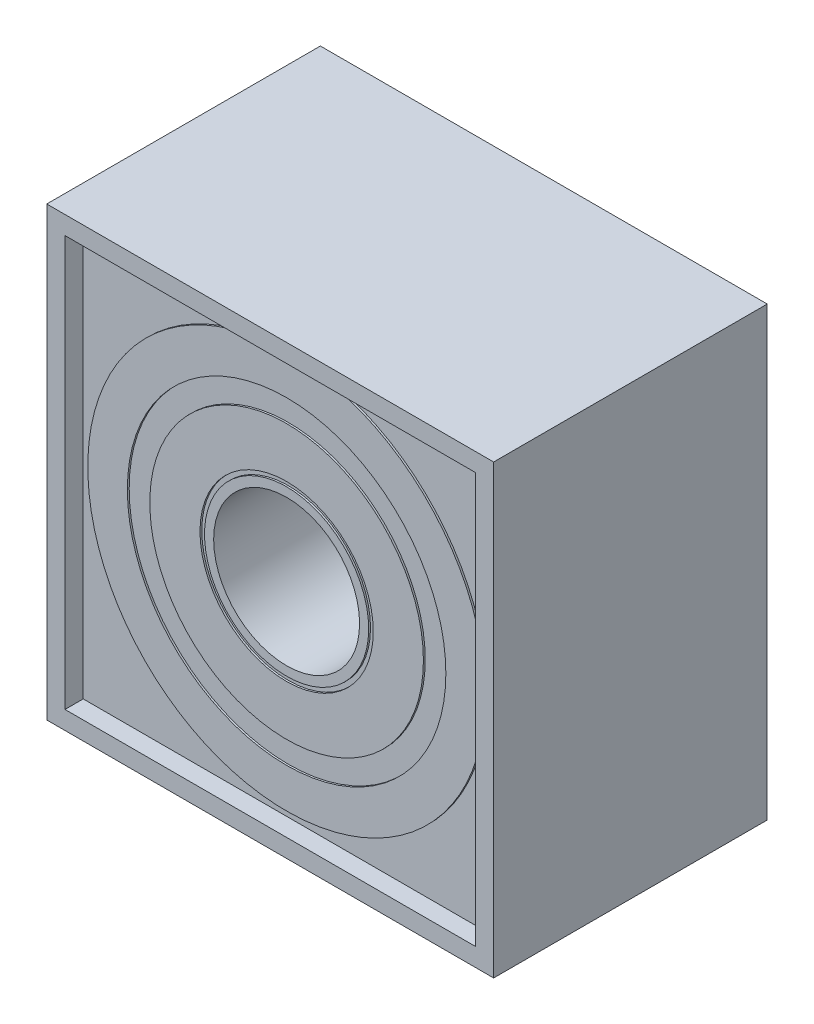
ISO-10303-21;
HEADER;
FILE_DESCRIPTION(('STEP AP214'),'2;1');
FILE_NAME('part.step','',(''),(''),'','','');
FILE_SCHEMA(('AUTOMOTIVE_DESIGN { 1 0 10303 214 1 1 1 1 }'));
ENDSEC;
DATA;
#1=APPLICATION_CONTEXT('core data for automotive mechanical design processes');
#2=APPLICATION_PROTOCOL_DEFINITION('international standard','automotive_design',2000,#1);
#3=PRODUCT_CONTEXT('',#1,'mechanical');
#4=PRODUCT('Part','Part','',(#3));
#5=PRODUCT_RELATED_PRODUCT_CATEGORY('part','',(#4));
#6=PRODUCT_DEFINITION_FORMATION('','',#4);
#7=PRODUCT_DEFINITION_CONTEXT('part definition',#1,'design');
#8=PRODUCT_DEFINITION('design','',#6,#7);
#9=PRODUCT_DEFINITION_SHAPE('','',#8);
#10=(LENGTH_UNIT() NAMED_UNIT(*) SI_UNIT(.MILLI.,.METRE.));
#11=(NAMED_UNIT(*) PLANE_ANGLE_UNIT() SI_UNIT($,.RADIAN.));
#12=(NAMED_UNIT(*) SI_UNIT($,.STERADIAN.) SOLID_ANGLE_UNIT());
#13=UNCERTAINTY_MEASURE_WITH_UNIT(LENGTH_MEASURE(1.E-05),#10,'distance_accuracy_value','');
#14=(GEOMETRIC_REPRESENTATION_CONTEXT(3) GLOBAL_UNCERTAINTY_ASSIGNED_CONTEXT((#13)) GLOBAL_UNIT_ASSIGNED_CONTEXT((#10,
#11,#12)) REPRESENTATION_CONTEXT('',''));
#15=CARTESIAN_POINT('',(0.,0.,0.));
#16=DIRECTION('',(0.,0.,1.));
#17=DIRECTION('',(1.,0.,0.));
#18=AXIS2_PLACEMENT_3D('',#15,#16,#17);
#19=CARTESIAN_POINT('',(0.,0.,14.));
#20=DIRECTION('',(0.,0.,-1.));
#21=DIRECTION('',(-1.,0.,0.));
#22=AXIS2_PLACEMENT_3D('',#19,#20,#21);
#23=PLANE('',#22);
#24=CARTESIAN_POINT('',(0.,0.,14.));
#25=DIRECTION('',(0.,0.,-1.));
#26=DIRECTION('',(-1.,0.,0.));
#27=AXIS2_PLACEMENT_3D('',#24,#25,#26);
#28=CIRCLE('',#27,7.5);
#29=CARTESIAN_POINT('',(7.5,0.,14.));
#30=VERTEX_POINT('',#29);
#31=EDGE_CURVE('E198',#30,#30,#28,.T.);
#32=ORIENTED_EDGE('',*,*,#31,.T.);
#33=EDGE_LOOP('',(#32));
#34=FACE_BOUND('',#33,.T.);
#35=CARTESIAN_POINT('',(0.,0.,14.));
#36=DIRECTION('',(0.,0.,-1.));
#37=DIRECTION('',(-1.,0.,0.));
#38=AXIS2_PLACEMENT_3D('',#35,#36,#37);
#39=CIRCLE('',#38,8.73034277512703);
#40=CARTESIAN_POINT('',(8.73034277512703,0.,14.));
#41=VERTEX_POINT('',#40);
#42=EDGE_CURVE('E12',#41,#41,#39,.T.);
#43=ORIENTED_EDGE('',*,*,#42,.F.);
#44=EDGE_LOOP('',(#43));
#45=FACE_BOUND('',#44,.T.);
#46=ADVANCED_FACE('F74',(#34,#45),#23,.F.);
#47=CARTESIAN_POINT('',(0.,0.,14.));
#48=DIRECTION('',(0.,0.,-1.));
#49=DIRECTION('',(-1.,0.,0.));
#50=AXIS2_PLACEMENT_3D('',#47,#48,#49);
#51=CIRCLE('',#50,4.5);
#52=CARTESIAN_POINT('',(4.5,0.,14.));
#53=VERTEX_POINT('',#52);
#54=EDGE_CURVE('E147',#53,#53,#51,.T.);
#55=ORIENTED_EDGE('',*,*,#54,.T.);
#56=EDGE_LOOP('',(#55));
#57=FACE_BOUND('',#56,.T.);
#58=CARTESIAN_POINT('',(0.,0.,14.));
#59=DIRECTION('',(0.,0.,-1.));
#60=DIRECTION('',(-1.,0.,0.));
#61=AXIS2_PLACEMENT_3D('',#58,#59,#60);
#62=CIRCLE('',#61,4.75);
#63=CARTESIAN_POINT('',(4.75,0.,14.));
#64=VERTEX_POINT('',#63);
#65=EDGE_CURVE('E83',#64,#64,#62,.T.);
#66=ORIENTED_EDGE('',*,*,#65,.F.);
#67=EDGE_LOOP('',(#66));
#68=FACE_BOUND('',#67,.T.);
#69=ADVANCED_FACE('F255',(#57,#68),#23,.F.);
#70=CARTESIAN_POINT('',(0.,0.,7.1));
#71=DIRECTION('',(0.,0.,1.));
#72=DIRECTION('',(1.,0.,0.));
#73=AXIS2_PLACEMENT_3D('',#70,#71,#72);
#74=CYLINDRICAL_SURFACE('',#73,4.);
#75=CARTESIAN_POINT('',(0.,0.,14.1));
#76=DIRECTION('',(0.,0.,1.));
#77=DIRECTION('',(1.,0.,0.));
#78=AXIS2_PLACEMENT_3D('',#75,#76,#77);
#79=CIRCLE('',#78,4.);
#80=CARTESIAN_POINT('',(4.,0.,14.1));
#81=VERTEX_POINT('',#80);
#82=EDGE_CURVE('E201',#81,#81,#79,.T.);
#83=CARTESIAN_POINT('',(0.,0.,0.));
#84=DIRECTION('',(0.,0.,-1.));
#85=DIRECTION('',(-1.,0.,0.));
#86=AXIS2_PLACEMENT_3D('',#83,#84,#85);
#87=CIRCLE('',#86,4.);
#88=CARTESIAN_POINT('',(4.,0.,0.));
#89=VERTEX_POINT('',#88);
#90=EDGE_CURVE('E78',#89,#89,#87,.T.);
#91=CARTESIAN_POINT('',(4.,0.,14.1));
#92=CARTESIAN_POINT('',(4.,0.,13.953125));
#93=CARTESIAN_POINT('',(4.,0.,13.80625));
#94=CARTESIAN_POINT('',(4.,0.,13.5125));
#95=CARTESIAN_POINT('',(4.,0.,13.365625));
#96=CARTESIAN_POINT('',(4.,0.,13.071875));
#97=CARTESIAN_POINT('',(4.,0.,12.925));
#98=CARTESIAN_POINT('',(4.,0.,12.63125));
#99=CARTESIAN_POINT('',(4.,0.,12.484375));
#100=CARTESIAN_POINT('',(4.,0.,12.190625));
#101=CARTESIAN_POINT('',(4.,0.,12.04375));
#102=CARTESIAN_POINT('',(4.,0.,11.75));
#103=CARTESIAN_POINT('',(4.,0.,11.603125));
#104=CARTESIAN_POINT('',(4.,0.,11.309375));
#105=CARTESIAN_POINT('',(4.,0.,11.1625));
#106=CARTESIAN_POINT('',(4.,0.,10.86875));
#107=CARTESIAN_POINT('',(4.,0.,10.721875));
#108=CARTESIAN_POINT('',(4.,0.,10.428125));
#109=CARTESIAN_POINT('',(4.,0.,10.28125));
#110=CARTESIAN_POINT('',(4.,0.,9.9875));
#111=CARTESIAN_POINT('',(4.,0.,9.840625));
#112=CARTESIAN_POINT('',(4.,0.,9.546875));
#113=CARTESIAN_POINT('',(4.,0.,9.4));
#114=CARTESIAN_POINT('',(4.,0.,9.10625));
#115=CARTESIAN_POINT('',(4.,0.,8.959375));
#116=CARTESIAN_POINT('',(4.,0.,8.665625));
#117=CARTESIAN_POINT('',(4.,0.,8.51875));
#118=CARTESIAN_POINT('',(4.,0.,8.225));
#119=CARTESIAN_POINT('',(4.,0.,8.078125));
#120=CARTESIAN_POINT('',(4.,0.,7.784375));
#121=CARTESIAN_POINT('',(4.,0.,7.6375));
#122=CARTESIAN_POINT('',(4.,0.,7.34375));
#123=CARTESIAN_POINT('',(4.,0.,7.196875));
#124=CARTESIAN_POINT('',(4.,0.,6.903125));
#125=CARTESIAN_POINT('',(4.,0.,6.75625));
#126=CARTESIAN_POINT('',(4.,0.,6.4625));
#127=CARTESIAN_POINT('',(4.,0.,6.315625));
#128=CARTESIAN_POINT('',(4.,0.,6.021875));
#129=CARTESIAN_POINT('',(4.,0.,5.875));
#130=CARTESIAN_POINT('',(4.,0.,5.58125));
#131=CARTESIAN_POINT('',(4.,0.,5.434375));
#132=CARTESIAN_POINT('',(4.,0.,5.140625));
#133=CARTESIAN_POINT('',(4.,0.,4.99375));
#134=CARTESIAN_POINT('',(4.,0.,4.7));
#135=CARTESIAN_POINT('',(4.,0.,4.553125));
#136=CARTESIAN_POINT('',(4.,0.,4.259375));
#137=CARTESIAN_POINT('',(4.,0.,4.1125));
#138=CARTESIAN_POINT('',(4.,0.,3.81875));
#139=CARTESIAN_POINT('',(4.,0.,3.671875));
#140=CARTESIAN_POINT('',(4.,0.,3.378125));
#141=CARTESIAN_POINT('',(4.,0.,3.23125));
#142=CARTESIAN_POINT('',(4.,0.,2.9375));
#143=CARTESIAN_POINT('',(4.,0.,2.790625));
#144=CARTESIAN_POINT('',(4.,0.,2.496875));
#145=CARTESIAN_POINT('',(4.,0.,2.35));
#146=CARTESIAN_POINT('',(4.,0.,2.05625));
#147=CARTESIAN_POINT('',(4.,0.,1.909375));
#148=CARTESIAN_POINT('',(4.,0.,1.615625));
#149=CARTESIAN_POINT('',(4.,0.,1.46875));
#150=CARTESIAN_POINT('',(4.,0.,1.175));
#151=CARTESIAN_POINT('',(4.,0.,1.028125));
#152=CARTESIAN_POINT('',(4.,0.,0.734375));
#153=CARTESIAN_POINT('',(4.,0.,0.5875));
#154=CARTESIAN_POINT('',(4.,0.,0.29375));
#155=CARTESIAN_POINT('',(4.,0.,0.146875));
#156=CARTESIAN_POINT('',(4.,0.,0.));
#157=B_SPLINE_CURVE_WITH_KNOTS('',3,(#91,#92,#93,#94,#95,#96,#97,#98,#99,#100,#101,#102,#103,
#104,#105,#106,#107,#108,#109,#110,#111,#112,#113,#114,#115,#116,#117,#118,#119,#120,#121,#122,
#123,#124,#125,#126,#127,#128,#129,#130,#131,#132,#133,#134,#135,#136,#137,#138,#139,#140,#141,
#142,#143,#144,#145,#146,#147,#148,#149,#150,#151,#152,#153,#154,#155,#156),.UNSPECIFIED.,.F.,
.F.,(4,2,2,2,2,2,2,2,2,2,2,2,2,2,2,2,2,2,2,2,2,2,2,2,2,2,2,2,2,2,2,2,4),(0.,0.440625,0.88125,
1.321875,1.7625,2.203125,2.64375,3.084375,3.525,3.965625,4.40625,4.846875,5.2875,5.728125,
6.16875,6.609375,7.05,7.490625,7.93125,8.371875,8.8125,9.253125,9.69375,10.134375,10.575,
11.015625,11.45625,11.896875,12.3375,12.778125,13.21875,13.659375,14.1),.UNSPECIFIED.);
#158=EDGE_CURVE('BSEAM260',#81,#89,#157,.T.);
#159=ORIENTED_EDGE('',*,*,#82,.T.);
#160=ORIENTED_EDGE('',*,*,#90,.T.);
#161=ORIENTED_EDGE('',*,*,#158,.T.);
#162=ORIENTED_EDGE('',*,*,#158,.F.);
#163=EDGE_LOOP('',(#159,#161,#160,#162));
#164=FACE_BOUND('',#163,.T.);
#165=ADVANCED_FACE('F260',(#164),#74,.F.);
#166=CARTESIAN_POINT('',(0.,0.,7.1));
#167=DIRECTION('',(0.,0.,1.));
#168=DIRECTION('',(1.,0.,0.));
#169=AXIS2_PLACEMENT_3D('',#166,#167,#168);
#170=CYLINDRICAL_SURFACE('',#169,4.5);
#171=CARTESIAN_POINT('',(0.,0.,14.1));
#172=DIRECTION('',(0.,0.,1.));
#173=DIRECTION('',(1.,0.,0.));
#174=AXIS2_PLACEMENT_3D('',#171,#172,#173);
#175=CIRCLE('',#174,4.5);
#176=CARTESIAN_POINT('',(4.5,0.,14.1));
#177=VERTEX_POINT('',#176);
#178=EDGE_CURVE('E197',#177,#177,#175,.T.);
#179=CARTESIAN_POINT('',(4.5,0.,14.1));
#180=CARTESIAN_POINT('',(4.5,0.,14.0989583333333));
#181=CARTESIAN_POINT('',(4.5,0.,14.0979166666667));
#182=CARTESIAN_POINT('',(4.5,0.,14.0958333333333));
#183=CARTESIAN_POINT('',(4.5,0.,14.0947916666667));
#184=CARTESIAN_POINT('',(4.5,0.,14.0927083333333));
#185=CARTESIAN_POINT('',(4.5,0.,14.0916666666667));
#186=CARTESIAN_POINT('',(4.5,0.,14.0895833333333));
#187=CARTESIAN_POINT('',(4.5,0.,14.0885416666667));
#188=CARTESIAN_POINT('',(4.5,0.,14.0864583333333));
#189=CARTESIAN_POINT('',(4.5,0.,14.0854166666667));
#190=CARTESIAN_POINT('',(4.5,0.,14.0833333333333));
#191=CARTESIAN_POINT('',(4.5,0.,14.0822916666667));
#192=CARTESIAN_POINT('',(4.5,0.,14.0802083333333));
#193=CARTESIAN_POINT('',(4.5,0.,14.0791666666667));
#194=CARTESIAN_POINT('',(4.5,0.,14.0770833333333));
#195=CARTESIAN_POINT('',(4.5,0.,14.0760416666667));
#196=CARTESIAN_POINT('',(4.5,0.,14.0739583333333));
#197=CARTESIAN_POINT('',(4.5,0.,14.0729166666667));
#198=CARTESIAN_POINT('',(4.5,0.,14.0708333333333));
#199=CARTESIAN_POINT('',(4.5,0.,14.0697916666667));
#200=CARTESIAN_POINT('',(4.5,0.,14.0677083333333));
#201=CARTESIAN_POINT('',(4.5,0.,14.0666666666667));
#202=CARTESIAN_POINT('',(4.5,0.,14.0645833333333));
#203=CARTESIAN_POINT('',(4.5,0.,14.0635416666667));
#204=CARTESIAN_POINT('',(4.5,0.,14.0614583333333));
#205=CARTESIAN_POINT('',(4.5,0.,14.0604166666667));
#206=CARTESIAN_POINT('',(4.5,0.,14.0583333333333));
#207=CARTESIAN_POINT('',(4.5,0.,14.0572916666667));
#208=CARTESIAN_POINT('',(4.5,0.,14.0552083333333));
#209=CARTESIAN_POINT('',(4.5,0.,14.0541666666667));
#210=CARTESIAN_POINT('',(4.5,0.,14.0520833333333));
#211=CARTESIAN_POINT('',(4.5,0.,14.0510416666667));
#212=CARTESIAN_POINT('',(4.5,0.,14.0489583333333));
#213=CARTESIAN_POINT('',(4.5,0.,14.0479166666667));
#214=CARTESIAN_POINT('',(4.5,0.,14.0458333333333));
#215=CARTESIAN_POINT('',(4.5,0.,14.0447916666667));
#216=CARTESIAN_POINT('',(4.5,0.,14.0427083333333));
#217=CARTESIAN_POINT('',(4.5,0.,14.0416666666667));
#218=CARTESIAN_POINT('',(4.5,0.,14.0395833333333));
#219=CARTESIAN_POINT('',(4.5,0.,14.0385416666667));
#220=CARTESIAN_POINT('',(4.5,0.,14.0364583333333));
#221=CARTESIAN_POINT('',(4.5,0.,14.0354166666667));
#222=CARTESIAN_POINT('',(4.5,0.,14.0333333333333));
#223=CARTESIAN_POINT('',(4.5,0.,14.0322916666667));
#224=CARTESIAN_POINT('',(4.5,0.,14.0302083333333));
#225=CARTESIAN_POINT('',(4.5,0.,14.0291666666667));
#226=CARTESIAN_POINT('',(4.5,0.,14.0270833333333));
#227=CARTESIAN_POINT('',(4.5,0.,14.0260416666667));
#228=CARTESIAN_POINT('',(4.5,0.,14.0239583333333));
#229=CARTESIAN_POINT('',(4.5,0.,14.0229166666667));
#230=CARTESIAN_POINT('',(4.5,0.,14.0208333333333));
#231=CARTESIAN_POINT('',(4.5,0.,14.0197916666667));
#232=CARTESIAN_POINT('',(4.5,0.,14.0177083333333));
#233=CARTESIAN_POINT('',(4.5,0.,14.0166666666667));
#234=CARTESIAN_POINT('',(4.5,0.,14.0145833333333));
#235=CARTESIAN_POINT('',(4.5,0.,14.0135416666667));
#236=CARTESIAN_POINT('',(4.5,0.,14.0114583333333));
#237=CARTESIAN_POINT('',(4.5,0.,14.0104166666667));
#238=CARTESIAN_POINT('',(4.5,0.,14.0083333333333));
#239=CARTESIAN_POINT('',(4.5,0.,14.0072916666667));
#240=CARTESIAN_POINT('',(4.5,0.,14.0052083333333));
#241=CARTESIAN_POINT('',(4.5,0.,14.0041666666667));
#242=CARTESIAN_POINT('',(4.5,0.,14.0020833333333));
#243=CARTESIAN_POINT('',(4.5,0.,14.0010416666667));
#244=CARTESIAN_POINT('',(4.5,0.,14.));
#245=B_SPLINE_CURVE_WITH_KNOTS('',3,(#179,#180,#181,#182,#183,#184,#185,#186,#187,#188,#189,
#190,#191,#192,#193,#194,#195,#196,#197,#198,#199,#200,#201,#202,#203,#204,#205,#206,#207,#208,
#209,#210,#211,#212,#213,#214,#215,#216,#217,#218,#219,#220,#221,#222,#223,#224,#225,#226,#227,
#228,#229,#230,#231,#232,#233,#234,#235,#236,#237,#238,#239,#240,#241,#242,#243,#244),
.UNSPECIFIED.,.F.,.F.,(4,2,2,2,2,2,2,2,2,2,2,2,2,2,2,2,2,2,2,2,2,2,2,2,2,2,2,2,2,2,2,2,4),(0.,
0.00312499999999966,0.00624999999999931,0.0093750000000007,0.0125000000000004,0.015625,
0.0187499999999997,0.0218749999999993,0.024999999999999,0.0281249999999986,0.0312499999999983,
0.0343749999999979,0.0374999999999976,0.0406249999999973,0.0437499999999987,0.0468749999999983,
0.049999999999998,0.0531249999999976,0.0562499999999973,0.0593749999999987,0.0624999999999983,
0.065624999999998,0.0687499999999976,0.0718749999999973,0.0749999999999969,0.0781249999999966,
0.0812499999999963,0.0843749999999959,0.0874999999999956,0.0906249999999952,0.0937499999999966,
0.0968749999999963,0.0999999999999959),.UNSPECIFIED.);
#246=EDGE_CURVE('BSEAM371',#177,#53,#245,.T.);
#247=ORIENTED_EDGE('',*,*,#178,.F.);
#248=ORIENTED_EDGE('',*,*,#54,.F.);
#249=ORIENTED_EDGE('',*,*,#246,.T.);
#250=ORIENTED_EDGE('',*,*,#246,.F.);
#251=EDGE_LOOP('',(#247,#249,#248,#250));
#252=FACE_BOUND('',#251,.T.);
#253=ADVANCED_FACE('F371',(#252),#170,.T.);
#254=CARTESIAN_POINT('',(0.,0.,14.1));
#255=DIRECTION('',(0.,0.,1.));
#256=DIRECTION('',(1.,0.,0.));
#257=AXIS2_PLACEMENT_3D('',#254,#255,#256);
#258=PLANE('',#257);
#259=ORIENTED_EDGE('',*,*,#82,.F.);
#260=EDGE_LOOP('',(#259));
#261=FACE_BOUND('',#260,.T.);
#262=ORIENTED_EDGE('',*,*,#178,.T.);
#263=EDGE_LOOP('',(#262));
#264=FACE_BOUND('',#263,.T.);
#265=ADVANCED_FACE('F376',(#261,#264),#258,.T.);
#266=CARTESIAN_POINT('',(0.,0.,7.1));
#267=DIRECTION('',(0.,0.,1.));
#268=DIRECTION('',(1.,0.,0.));
#269=AXIS2_PLACEMENT_3D('',#266,#267,#268);
#270=CYLINDRICAL_SURFACE('',#269,4.75);
#271=CARTESIAN_POINT('',(0.,0.,14.1));
#272=DIRECTION('',(0.,0.,1.));
#273=DIRECTION('',(1.,0.,0.));
#274=AXIS2_PLACEMENT_3D('',#271,#272,#273);
#275=CIRCLE('',#274,4.75);
#276=CARTESIAN_POINT('',(4.75,0.,14.1));
#277=VERTEX_POINT('',#276);
#278=EDGE_CURVE('E207',#277,#277,#275,.T.);
#279=CARTESIAN_POINT('',(4.75,0.,14.1));
#280=CARTESIAN_POINT('',(4.75,0.,14.0989583333333));
#281=CARTESIAN_POINT('',(4.75,0.,14.0979166666667));
#282=CARTESIAN_POINT('',(4.75,0.,14.0958333333333));
#283=CARTESIAN_POINT('',(4.75,0.,14.0947916666667));
#284=CARTESIAN_POINT('',(4.75,0.,14.0927083333333));
#285=CARTESIAN_POINT('',(4.75,0.,14.0916666666667));
#286=CARTESIAN_POINT('',(4.75,0.,14.0895833333333));
#287=CARTESIAN_POINT('',(4.75,0.,14.0885416666667));
#288=CARTESIAN_POINT('',(4.75,0.,14.0864583333333));
#289=CARTESIAN_POINT('',(4.75,0.,14.0854166666667));
#290=CARTESIAN_POINT('',(4.75,0.,14.0833333333333));
#291=CARTESIAN_POINT('',(4.75,0.,14.0822916666667));
#292=CARTESIAN_POINT('',(4.75,0.,14.0802083333333));
#293=CARTESIAN_POINT('',(4.75,0.,14.0791666666667));
#294=CARTESIAN_POINT('',(4.75,0.,14.0770833333333));
#295=CARTESIAN_POINT('',(4.75,0.,14.0760416666667));
#296=CARTESIAN_POINT('',(4.75,0.,14.0739583333333));
#297=CARTESIAN_POINT('',(4.75,0.,14.0729166666667));
#298=CARTESIAN_POINT('',(4.75,0.,14.0708333333333));
#299=CARTESIAN_POINT('',(4.75,0.,14.0697916666667));
#300=CARTESIAN_POINT('',(4.75,0.,14.0677083333333));
#301=CARTESIAN_POINT('',(4.75,0.,14.0666666666667));
#302=CARTESIAN_POINT('',(4.75,0.,14.0645833333333));
#303=CARTESIAN_POINT('',(4.75,0.,14.0635416666667));
#304=CARTESIAN_POINT('',(4.75,0.,14.0614583333333));
#305=CARTESIAN_POINT('',(4.75,0.,14.0604166666667));
#306=CARTESIAN_POINT('',(4.75,0.,14.0583333333333));
#307=CARTESIAN_POINT('',(4.75,0.,14.0572916666667));
#308=CARTESIAN_POINT('',(4.75,0.,14.0552083333333));
#309=CARTESIAN_POINT('',(4.75,0.,14.0541666666667));
#310=CARTESIAN_POINT('',(4.75,0.,14.0520833333333));
#311=CARTESIAN_POINT('',(4.75,0.,14.0510416666667));
#312=CARTESIAN_POINT('',(4.75,0.,14.0489583333333));
#313=CARTESIAN_POINT('',(4.75,0.,14.0479166666667));
#314=CARTESIAN_POINT('',(4.75,0.,14.0458333333333));
#315=CARTESIAN_POINT('',(4.75,0.,14.0447916666667));
#316=CARTESIAN_POINT('',(4.75,0.,14.0427083333333));
#317=CARTESIAN_POINT('',(4.75,0.,14.0416666666667));
#318=CARTESIAN_POINT('',(4.75,0.,14.0395833333333));
#319=CARTESIAN_POINT('',(4.75,0.,14.0385416666667));
#320=CARTESIAN_POINT('',(4.75,0.,14.0364583333333));
#321=CARTESIAN_POINT('',(4.75,0.,14.0354166666667));
#322=CARTESIAN_POINT('',(4.75,0.,14.0333333333333));
#323=CARTESIAN_POINT('',(4.75,0.,14.0322916666667));
#324=CARTESIAN_POINT('',(4.75,0.,14.0302083333333));
#325=CARTESIAN_POINT('',(4.75,0.,14.0291666666667));
#326=CARTESIAN_POINT('',(4.75,0.,14.0270833333333));
#327=CARTESIAN_POINT('',(4.75,0.,14.0260416666667));
#328=CARTESIAN_POINT('',(4.75,0.,14.0239583333333));
#329=CARTESIAN_POINT('',(4.75,0.,14.0229166666667));
#330=CARTESIAN_POINT('',(4.75,0.,14.0208333333333));
#331=CARTESIAN_POINT('',(4.75,0.,14.0197916666667));
#332=CARTESIAN_POINT('',(4.75,0.,14.0177083333333));
#333=CARTESIAN_POINT('',(4.75,0.,14.0166666666667));
#334=CARTESIAN_POINT('',(4.75,0.,14.0145833333333));
#335=CARTESIAN_POINT('',(4.75,0.,14.0135416666667));
#336=CARTESIAN_POINT('',(4.75,0.,14.0114583333333));
#337=CARTESIAN_POINT('',(4.75,0.,14.0104166666667));
#338=CARTESIAN_POINT('',(4.75,0.,14.0083333333333));
#339=CARTESIAN_POINT('',(4.75,0.,14.0072916666667));
#340=CARTESIAN_POINT('',(4.75,0.,14.0052083333333));
#341=CARTESIAN_POINT('',(4.75,0.,14.0041666666667));
#342=CARTESIAN_POINT('',(4.75,0.,14.0020833333333));
#343=CARTESIAN_POINT('',(4.75,0.,14.0010416666667));
#344=CARTESIAN_POINT('',(4.75,0.,14.));
#345=B_SPLINE_CURVE_WITH_KNOTS('',3,(#279,#280,#281,#282,#283,#284,#285,#286,#287,#288,#289,
#290,#291,#292,#293,#294,#295,#296,#297,#298,#299,#300,#301,#302,#303,#304,#305,#306,#307,#308,
#309,#310,#311,#312,#313,#314,#315,#316,#317,#318,#319,#320,#321,#322,#323,#324,#325,#326,#327,
#328,#329,#330,#331,#332,#333,#334,#335,#336,#337,#338,#339,#340,#341,#342,#343,#344),
.UNSPECIFIED.,.F.,.F.,(4,2,2,2,2,2,2,2,2,2,2,2,2,2,2,2,2,2,2,2,2,2,2,2,2,2,2,2,2,2,2,2,4),(0.,
0.00312499999999966,0.00624999999999931,0.0093750000000007,0.0125000000000004,0.015625,
0.0187499999999997,0.0218749999999993,0.024999999999999,0.0281249999999986,0.0312499999999983,
0.0343749999999979,0.0374999999999976,0.0406249999999973,0.0437499999999987,0.0468749999999983,
0.049999999999998,0.0531249999999976,0.0562499999999973,0.0593749999999987,0.0624999999999983,
0.065624999999998,0.0687499999999976,0.0718749999999973,0.0749999999999969,0.0781249999999966,
0.0812499999999963,0.0843749999999959,0.0874999999999956,0.0906249999999952,0.0937499999999966,
0.0968749999999963,0.0999999999999959),.UNSPECIFIED.);
#346=EDGE_CURVE('BSEAM386',#277,#64,#345,.T.);
#347=ORIENTED_EDGE('',*,*,#278,.T.);
#348=ORIENTED_EDGE('',*,*,#65,.T.);
#349=ORIENTED_EDGE('',*,*,#346,.T.);
#350=ORIENTED_EDGE('',*,*,#346,.F.);
#351=EDGE_LOOP('',(#347,#349,#348,#350));
#352=FACE_BOUND('',#351,.T.);
#353=ADVANCED_FACE('F386',(#352),#270,.F.);
#354=CARTESIAN_POINT('',(0.,0.,7.1));
#355=DIRECTION('',(0.,0.,1.));
#356=DIRECTION('',(1.,0.,0.));
#357=AXIS2_PLACEMENT_3D('',#354,#355,#356);
#358=CYLINDRICAL_SURFACE('',#357,7.5);
#359=CARTESIAN_POINT('',(0.,0.,14.1));
#360=DIRECTION('',(0.,0.,1.));
#361=DIRECTION('',(1.,0.,0.));
#362=AXIS2_PLACEMENT_3D('',#359,#360,#361);
#363=CIRCLE('',#362,7.5);
#364=CARTESIAN_POINT('',(7.5,0.,14.1));
#365=VERTEX_POINT('',#364);
#366=EDGE_CURVE('E202',#365,#365,#363,.T.);
#367=CARTESIAN_POINT('',(7.5,0.,14.1));
#368=CARTESIAN_POINT('',(7.5,0.,14.0989583333333));
#369=CARTESIAN_POINT('',(7.5,0.,14.0979166666667));
#370=CARTESIAN_POINT('',(7.5,0.,14.0958333333333));
#371=CARTESIAN_POINT('',(7.5,0.,14.0947916666667));
#372=CARTESIAN_POINT('',(7.5,0.,14.0927083333333));
#373=CARTESIAN_POINT('',(7.5,0.,14.0916666666667));
#374=CARTESIAN_POINT('',(7.5,0.,14.0895833333333));
#375=CARTESIAN_POINT('',(7.5,0.,14.0885416666667));
#376=CARTESIAN_POINT('',(7.5,0.,14.0864583333333));
#377=CARTESIAN_POINT('',(7.5,0.,14.0854166666667));
#378=CARTESIAN_POINT('',(7.5,0.,14.0833333333333));
#379=CARTESIAN_POINT('',(7.5,0.,14.0822916666667));
#380=CARTESIAN_POINT('',(7.5,0.,14.0802083333333));
#381=CARTESIAN_POINT('',(7.5,0.,14.0791666666667));
#382=CARTESIAN_POINT('',(7.5,0.,14.0770833333333));
#383=CARTESIAN_POINT('',(7.5,0.,14.0760416666667));
#384=CARTESIAN_POINT('',(7.5,0.,14.0739583333333));
#385=CARTESIAN_POINT('',(7.5,0.,14.0729166666667));
#386=CARTESIAN_POINT('',(7.5,0.,14.0708333333333));
#387=CARTESIAN_POINT('',(7.5,0.,14.0697916666667));
#388=CARTESIAN_POINT('',(7.5,0.,14.0677083333333));
#389=CARTESIAN_POINT('',(7.5,0.,14.0666666666667));
#390=CARTESIAN_POINT('',(7.5,0.,14.0645833333333));
#391=CARTESIAN_POINT('',(7.5,0.,14.0635416666667));
#392=CARTESIAN_POINT('',(7.5,0.,14.0614583333333));
#393=CARTESIAN_POINT('',(7.5,0.,14.0604166666667));
#394=CARTESIAN_POINT('',(7.5,0.,14.0583333333333));
#395=CARTESIAN_POINT('',(7.5,0.,14.0572916666667));
#396=CARTESIAN_POINT('',(7.5,0.,14.0552083333333));
#397=CARTESIAN_POINT('',(7.5,0.,14.0541666666667));
#398=CARTESIAN_POINT('',(7.5,0.,14.0520833333333));
#399=CARTESIAN_POINT('',(7.5,0.,14.0510416666667));
#400=CARTESIAN_POINT('',(7.5,0.,14.0489583333333));
#401=CARTESIAN_POINT('',(7.5,0.,14.0479166666667));
#402=CARTESIAN_POINT('',(7.5,0.,14.0458333333333));
#403=CARTESIAN_POINT('',(7.5,0.,14.0447916666667));
#404=CARTESIAN_POINT('',(7.5,0.,14.0427083333333));
#405=CARTESIAN_POINT('',(7.5,0.,14.0416666666667));
#406=CARTESIAN_POINT('',(7.5,0.,14.0395833333333));
#407=CARTESIAN_POINT('',(7.5,0.,14.0385416666667));
#408=CARTESIAN_POINT('',(7.5,0.,14.0364583333333));
#409=CARTESIAN_POINT('',(7.5,0.,14.0354166666667));
#410=CARTESIAN_POINT('',(7.5,0.,14.0333333333333));
#411=CARTESIAN_POINT('',(7.5,0.,14.0322916666667));
#412=CARTESIAN_POINT('',(7.5,0.,14.0302083333333));
#413=CARTESIAN_POINT('',(7.5,0.,14.0291666666667));
#414=CARTESIAN_POINT('',(7.5,0.,14.0270833333333));
#415=CARTESIAN_POINT('',(7.5,0.,14.0260416666667));
#416=CARTESIAN_POINT('',(7.5,0.,14.0239583333333));
#417=CARTESIAN_POINT('',(7.5,0.,14.0229166666667));
#418=CARTESIAN_POINT('',(7.5,0.,14.0208333333333));
#419=CARTESIAN_POINT('',(7.5,0.,14.0197916666667));
#420=CARTESIAN_POINT('',(7.5,0.,14.0177083333333));
#421=CARTESIAN_POINT('',(7.5,0.,14.0166666666667));
#422=CARTESIAN_POINT('',(7.5,0.,14.0145833333333));
#423=CARTESIAN_POINT('',(7.5,0.,14.0135416666667));
#424=CARTESIAN_POINT('',(7.5,0.,14.0114583333333));
#425=CARTESIAN_POINT('',(7.5,0.,14.0104166666667));
#426=CARTESIAN_POINT('',(7.5,0.,14.0083333333333));
#427=CARTESIAN_POINT('',(7.5,0.,14.0072916666667));
#428=CARTESIAN_POINT('',(7.5,0.,14.0052083333333));
#429=CARTESIAN_POINT('',(7.5,0.,14.0041666666667));
#430=CARTESIAN_POINT('',(7.5,0.,14.0020833333333));
#431=CARTESIAN_POINT('',(7.5,0.,14.0010416666667));
#432=CARTESIAN_POINT('',(7.5,0.,14.));
#433=B_SPLINE_CURVE_WITH_KNOTS('',3,(#367,#368,#369,#370,#371,#372,#373,#374,#375,#376,#377,
#378,#379,#380,#381,#382,#383,#384,#385,#386,#387,#388,#389,#390,#391,#392,#393,#394,#395,#396,
#397,#398,#399,#400,#401,#402,#403,#404,#405,#406,#407,#408,#409,#410,#411,#412,#413,#414,#415,
#416,#417,#418,#419,#420,#421,#422,#423,#424,#425,#426,#427,#428,#429,#430,#431,#432),
.UNSPECIFIED.,.F.,.F.,(4,2,2,2,2,2,2,2,2,2,2,2,2,2,2,2,2,2,2,2,2,2,2,2,2,2,2,2,2,2,2,2,4),(0.,
0.00312499999999966,0.00624999999999931,0.0093750000000007,0.0125000000000004,0.015625,
0.0187499999999997,0.0218749999999993,0.024999999999999,0.0281249999999986,0.0312499999999983,
0.0343749999999979,0.0374999999999976,0.0406249999999973,0.0437499999999987,0.0468749999999983,
0.049999999999998,0.0531249999999976,0.0562499999999973,0.0593749999999987,0.0624999999999983,
0.065624999999998,0.0687499999999976,0.0718749999999973,0.0749999999999969,0.0781249999999966,
0.0812499999999963,0.0843749999999959,0.0874999999999956,0.0906249999999952,0.0937499999999966,
0.0968749999999963,0.0999999999999959),.UNSPECIFIED.);
#434=EDGE_CURVE('BSEAM396',#365,#30,#433,.T.);
#435=ORIENTED_EDGE('',*,*,#366,.F.);
#436=ORIENTED_EDGE('',*,*,#31,.F.);
#437=ORIENTED_EDGE('',*,*,#434,.T.);
#438=ORIENTED_EDGE('',*,*,#434,.F.);
#439=EDGE_LOOP('',(#435,#437,#436,#438));
#440=FACE_BOUND('',#439,.T.);
#441=ADVANCED_FACE('F396',(#440),#358,.T.);
#442=CARTESIAN_POINT('',(0.,0.,14.1));
#443=DIRECTION('',(0.,0.,1.));
#444=DIRECTION('',(1.,0.,0.));
#445=AXIS2_PLACEMENT_3D('',#442,#443,#444);
#446=PLANE('',#445);
#447=ORIENTED_EDGE('',*,*,#278,.F.);
#448=EDGE_LOOP('',(#447));
#449=FACE_BOUND('',#448,.T.);
#450=ORIENTED_EDGE('',*,*,#366,.T.);
#451=EDGE_LOOP('',(#450));
#452=FACE_BOUND('',#451,.T.);
#453=ADVANCED_FACE('F406',(#449,#452),#446,.T.);
#454=CARTESIAN_POINT('',(0.,0.,7.1));
#455=DIRECTION('',(0.,0.,1.));
#456=DIRECTION('',(1.,0.,0.));
#457=AXIS2_PLACEMENT_3D('',#454,#455,#456);
#458=CYLINDRICAL_SURFACE('',#457,8.73034277512703);
#459=CARTESIAN_POINT('',(0.,0.,14.1));
#460=DIRECTION('',(0.,0.,1.));
#461=DIRECTION('',(1.,0.,0.));
#462=AXIS2_PLACEMENT_3D('',#459,#460,#461);
#463=CIRCLE('',#462,8.73034277512703);
#464=CARTESIAN_POINT('',(8.73034277512703,0.,14.1));
#465=VERTEX_POINT('',#464);
#466=EDGE_CURVE('E214',#465,#465,#463,.T.);
#467=CARTESIAN_POINT('',(8.73034277512703,0.,14.1));
#468=CARTESIAN_POINT('',(8.73034277512703,0.,14.0989583333333));
#469=CARTESIAN_POINT('',(8.73034277512703,0.,14.0979166666667));
#470=CARTESIAN_POINT('',(8.73034277512703,0.,14.0958333333333));
#471=CARTESIAN_POINT('',(8.73034277512703,0.,14.0947916666667));
#472=CARTESIAN_POINT('',(8.73034277512703,0.,14.0927083333333));
#473=CARTESIAN_POINT('',(8.73034277512703,0.,14.0916666666667));
#474=CARTESIAN_POINT('',(8.73034277512703,0.,14.0895833333333));
#475=CARTESIAN_POINT('',(8.73034277512703,0.,14.0885416666667));
#476=CARTESIAN_POINT('',(8.73034277512703,0.,14.0864583333333));
#477=CARTESIAN_POINT('',(8.73034277512703,0.,14.0854166666667));
#478=CARTESIAN_POINT('',(8.73034277512703,0.,14.0833333333333));
#479=CARTESIAN_POINT('',(8.73034277512703,0.,14.0822916666667));
#480=CARTESIAN_POINT('',(8.73034277512703,0.,14.0802083333333));
#481=CARTESIAN_POINT('',(8.73034277512703,0.,14.0791666666667));
#482=CARTESIAN_POINT('',(8.73034277512703,0.,14.0770833333333));
#483=CARTESIAN_POINT('',(8.73034277512703,0.,14.0760416666667));
#484=CARTESIAN_POINT('',(8.73034277512703,0.,14.0739583333333));
#485=CARTESIAN_POINT('',(8.73034277512703,0.,14.0729166666667));
#486=CARTESIAN_POINT('',(8.73034277512703,0.,14.0708333333333));
#487=CARTESIAN_POINT('',(8.73034277512703,0.,14.0697916666667));
#488=CARTESIAN_POINT('',(8.73034277512703,0.,14.0677083333333));
#489=CARTESIAN_POINT('',(8.73034277512703,0.,14.0666666666667));
#490=CARTESIAN_POINT('',(8.73034277512703,0.,14.0645833333333));
#491=CARTESIAN_POINT('',(8.73034277512703,0.,14.0635416666667));
#492=CARTESIAN_POINT('',(8.73034277512703,0.,14.0614583333333));
#493=CARTESIAN_POINT('',(8.73034277512703,0.,14.0604166666667));
#494=CARTESIAN_POINT('',(8.73034277512703,0.,14.0583333333333));
#495=CARTESIAN_POINT('',(8.73034277512703,0.,14.0572916666667));
#496=CARTESIAN_POINT('',(8.73034277512703,0.,14.0552083333333));
#497=CARTESIAN_POINT('',(8.73034277512703,0.,14.0541666666667));
#498=CARTESIAN_POINT('',(8.73034277512703,0.,14.0520833333333));
#499=CARTESIAN_POINT('',(8.73034277512703,0.,14.0510416666667));
#500=CARTESIAN_POINT('',(8.73034277512703,0.,14.0489583333333));
#501=CARTESIAN_POINT('',(8.73034277512703,0.,14.0479166666667));
#502=CARTESIAN_POINT('',(8.73034277512703,0.,14.0458333333333));
#503=CARTESIAN_POINT('',(8.73034277512703,0.,14.0447916666667));
#504=CARTESIAN_POINT('',(8.73034277512703,0.,14.0427083333333));
#505=CARTESIAN_POINT('',(8.73034277512703,0.,14.0416666666667));
#506=CARTESIAN_POINT('',(8.73034277512703,0.,14.0395833333333));
#507=CARTESIAN_POINT('',(8.73034277512703,0.,14.0385416666667));
#508=CARTESIAN_POINT('',(8.73034277512703,0.,14.0364583333333));
#509=CARTESIAN_POINT('',(8.73034277512703,0.,14.0354166666667));
#510=CARTESIAN_POINT('',(8.73034277512703,0.,14.0333333333333));
#511=CARTESIAN_POINT('',(8.73034277512703,0.,14.0322916666667));
#512=CARTESIAN_POINT('',(8.73034277512703,0.,14.0302083333333));
#513=CARTESIAN_POINT('',(8.73034277512703,0.,14.0291666666667));
#514=CARTESIAN_POINT('',(8.73034277512703,0.,14.0270833333333));
#515=CARTESIAN_POINT('',(8.73034277512703,0.,14.0260416666667));
#516=CARTESIAN_POINT('',(8.73034277512703,0.,14.0239583333333));
#517=CARTESIAN_POINT('',(8.73034277512703,0.,14.0229166666667));
#518=CARTESIAN_POINT('',(8.73034277512703,0.,14.0208333333333));
#519=CARTESIAN_POINT('',(8.73034277512703,0.,14.0197916666667));
#520=CARTESIAN_POINT('',(8.73034277512703,0.,14.0177083333333));
#521=CARTESIAN_POINT('',(8.73034277512703,0.,14.0166666666667));
#522=CARTESIAN_POINT('',(8.73034277512703,0.,14.0145833333333));
#523=CARTESIAN_POINT('',(8.73034277512703,0.,14.0135416666667));
#524=CARTESIAN_POINT('',(8.73034277512703,0.,14.0114583333333));
#525=CARTESIAN_POINT('',(8.73034277512703,0.,14.0104166666667));
#526=CARTESIAN_POINT('',(8.73034277512703,0.,14.0083333333333));
#527=CARTESIAN_POINT('',(8.73034277512703,0.,14.0072916666667));
#528=CARTESIAN_POINT('',(8.73034277512703,0.,14.0052083333333));
#529=CARTESIAN_POINT('',(8.73034277512703,0.,14.0041666666667));
#530=CARTESIAN_POINT('',(8.73034277512703,0.,14.0020833333333));
#531=CARTESIAN_POINT('',(8.73034277512703,0.,14.0010416666667));
#532=CARTESIAN_POINT('',(8.73034277512703,0.,14.));
#533=B_SPLINE_CURVE_WITH_KNOTS('',3,(#467,#468,#469,#470,#471,#472,#473,#474,#475,#476,#477,
#478,#479,#480,#481,#482,#483,#484,#485,#486,#487,#488,#489,#490,#491,#492,#493,#494,#495,#496,
#497,#498,#499,#500,#501,#502,#503,#504,#505,#506,#507,#508,#509,#510,#511,#512,#513,#514,#515,
#516,#517,#518,#519,#520,#521,#522,#523,#524,#525,#526,#527,#528,#529,#530,#531,#532),
.UNSPECIFIED.,.F.,.F.,(4,2,2,2,2,2,2,2,2,2,2,2,2,2,2,2,2,2,2,2,2,2,2,2,2,2,2,2,2,2,2,2,4),(0.,
0.00312499999999966,0.00624999999999931,0.0093750000000007,0.0125000000000004,0.015625,
0.0187499999999997,0.0218749999999993,0.024999999999999,0.0281249999999986,0.0312499999999983,
0.0343749999999979,0.0374999999999976,0.0406249999999973,0.0437499999999987,0.0468749999999983,
0.049999999999998,0.0531249999999976,0.0562499999999973,0.0593749999999987,0.0624999999999983,
0.065624999999998,0.0687499999999976,0.0718749999999973,0.0749999999999969,0.0781249999999966,
0.0812499999999963,0.0843749999999959,0.0874999999999956,0.0906249999999952,0.0937499999999966,
0.0968749999999963,0.0999999999999959),.UNSPECIFIED.);
#534=EDGE_CURVE('BSEAM416',#465,#41,#533,.T.);
#535=ORIENTED_EDGE('',*,*,#466,.T.);
#536=ORIENTED_EDGE('',*,*,#42,.T.);
#537=ORIENTED_EDGE('',*,*,#534,.T.);
#538=ORIENTED_EDGE('',*,*,#534,.F.);
#539=EDGE_LOOP('',(#535,#537,#536,#538));
#540=FACE_BOUND('',#539,.T.);
#541=ADVANCED_FACE('F416',(#540),#458,.F.);
#542=CARTESIAN_POINT('',(0.,0.,7.1));
#543=DIRECTION('',(0.,0.,1.));
#544=DIRECTION('',(1.,0.,0.));
#545=AXIS2_PLACEMENT_3D('',#542,#543,#544);
#546=CYLINDRICAL_SURFACE('',#545,10.9);
#547=CARTESIAN_POINT('',(0.,0.,14.1));
#548=DIRECTION('',(0.,0.,1.));
#549=DIRECTION('',(1.,0.,0.));
#550=AXIS2_PLACEMENT_3D('',#547,#548,#549);
#551=CIRCLE('',#550,10.9);
#552=CARTESIAN_POINT('',(10.9,0.,14.1));
#553=VERTEX_POINT('',#552);
#554=EDGE_CURVE('E208',#553,#553,#551,.T.);
#555=CARTESIAN_POINT('',(0.,0.,14.));
#556=DIRECTION('',(0.,0.,-1.));
#557=DIRECTION('',(-1.,0.,0.));
#558=AXIS2_PLACEMENT_3D('',#555,#556,#557);
#559=CIRCLE('',#558,10.9);
#560=CARTESIAN_POINT('',(10.9,0.,14.));
#561=VERTEX_POINT('',#560);
#562=EDGE_CURVE('E205',#561,#561,#559,.T.);
#563=CARTESIAN_POINT('',(10.9,0.,14.1));
#564=CARTESIAN_POINT('',(10.9,0.,14.0989583333333));
#565=CARTESIAN_POINT('',(10.9,0.,14.0979166666667));
#566=CARTESIAN_POINT('',(10.9,0.,14.0958333333333));
#567=CARTESIAN_POINT('',(10.9,0.,14.0947916666667));
#568=CARTESIAN_POINT('',(10.9,0.,14.0927083333333));
#569=CARTESIAN_POINT('',(10.9,0.,14.0916666666667));
#570=CARTESIAN_POINT('',(10.9,0.,14.0895833333333));
#571=CARTESIAN_POINT('',(10.9,0.,14.0885416666667));
#572=CARTESIAN_POINT('',(10.9,0.,14.0864583333333));
#573=CARTESIAN_POINT('',(10.9,0.,14.0854166666667));
#574=CARTESIAN_POINT('',(10.9,0.,14.0833333333333));
#575=CARTESIAN_POINT('',(10.9,0.,14.0822916666667));
#576=CARTESIAN_POINT('',(10.9,0.,14.0802083333333));
#577=CARTESIAN_POINT('',(10.9,0.,14.0791666666667));
#578=CARTESIAN_POINT('',(10.9,0.,14.0770833333333));
#579=CARTESIAN_POINT('',(10.9,0.,14.0760416666667));
#580=CARTESIAN_POINT('',(10.9,0.,14.0739583333333));
#581=CARTESIAN_POINT('',(10.9,0.,14.0729166666667));
#582=CARTESIAN_POINT('',(10.9,0.,14.0708333333333));
#583=CARTESIAN_POINT('',(10.9,0.,14.0697916666667));
#584=CARTESIAN_POINT('',(10.9,0.,14.0677083333333));
#585=CARTESIAN_POINT('',(10.9,0.,14.0666666666667));
#586=CARTESIAN_POINT('',(10.9,0.,14.0645833333333));
#587=CARTESIAN_POINT('',(10.9,0.,14.0635416666667));
#588=CARTESIAN_POINT('',(10.9,0.,14.0614583333333));
#589=CARTESIAN_POINT('',(10.9,0.,14.0604166666667));
#590=CARTESIAN_POINT('',(10.9,0.,14.0583333333333));
#591=CARTESIAN_POINT('',(10.9,0.,14.0572916666667));
#592=CARTESIAN_POINT('',(10.9,0.,14.0552083333333));
#593=CARTESIAN_POINT('',(10.9,0.,14.0541666666667));
#594=CARTESIAN_POINT('',(10.9,0.,14.0520833333333));
#595=CARTESIAN_POINT('',(10.9,0.,14.0510416666667));
#596=CARTESIAN_POINT('',(10.9,0.,14.0489583333333));
#597=CARTESIAN_POINT('',(10.9,0.,14.0479166666667));
#598=CARTESIAN_POINT('',(10.9,0.,14.0458333333333));
#599=CARTESIAN_POINT('',(10.9,0.,14.0447916666667));
#600=CARTESIAN_POINT('',(10.9,0.,14.0427083333333));
#601=CARTESIAN_POINT('',(10.9,0.,14.0416666666667));
#602=CARTESIAN_POINT('',(10.9,0.,14.0395833333333));
#603=CARTESIAN_POINT('',(10.9,0.,14.0385416666667));
#604=CARTESIAN_POINT('',(10.9,0.,14.0364583333333));
#605=CARTESIAN_POINT('',(10.9,0.,14.0354166666667));
#606=CARTESIAN_POINT('',(10.9,0.,14.0333333333333));
#607=CARTESIAN_POINT('',(10.9,0.,14.0322916666667));
#608=CARTESIAN_POINT('',(10.9,0.,14.0302083333333));
#609=CARTESIAN_POINT('',(10.9,0.,14.0291666666667));
#610=CARTESIAN_POINT('',(10.9,0.,14.0270833333333));
#611=CARTESIAN_POINT('',(10.9,0.,14.0260416666667));
#612=CARTESIAN_POINT('',(10.9,0.,14.0239583333333));
#613=CARTESIAN_POINT('',(10.9,0.,14.0229166666667));
#614=CARTESIAN_POINT('',(10.9,0.,14.0208333333333));
#615=CARTESIAN_POINT('',(10.9,0.,14.0197916666667));
#616=CARTESIAN_POINT('',(10.9,0.,14.0177083333333));
#617=CARTESIAN_POINT('',(10.9,0.,14.0166666666667));
#618=CARTESIAN_POINT('',(10.9,0.,14.0145833333333));
#619=CARTESIAN_POINT('',(10.9,0.,14.0135416666667));
#620=CARTESIAN_POINT('',(10.9,0.,14.0114583333333));
#621=CARTESIAN_POINT('',(10.9,0.,14.0104166666667));
#622=CARTESIAN_POINT('',(10.9,0.,14.0083333333333));
#623=CARTESIAN_POINT('',(10.9,0.,14.0072916666667));
#624=CARTESIAN_POINT('',(10.9,0.,14.0052083333333));
#625=CARTESIAN_POINT('',(10.9,0.,14.0041666666667));
#626=CARTESIAN_POINT('',(10.9,0.,14.0020833333333));
#627=CARTESIAN_POINT('',(10.9,0.,14.0010416666667));
#628=CARTESIAN_POINT('',(10.9,0.,14.));
#629=B_SPLINE_CURVE_WITH_KNOTS('',3,(#563,#564,#565,#566,#567,#568,#569,#570,#571,#572,#573,
#574,#575,#576,#577,#578,#579,#580,#581,#582,#583,#584,#585,#586,#587,#588,#589,#590,#591,#592,
#593,#594,#595,#596,#597,#598,#599,#600,#601,#602,#603,#604,#605,#606,#607,#608,#609,#610,#611,
#612,#613,#614,#615,#616,#617,#618,#619,#620,#621,#622,#623,#624,#625,#626,#627,#628),
.UNSPECIFIED.,.F.,.F.,(4,2,2,2,2,2,2,2,2,2,2,2,2,2,2,2,2,2,2,2,2,2,2,2,2,2,2,2,2,2,2,2,4),(0.,
0.00312499999999966,0.00624999999999931,0.0093750000000007,0.0125000000000004,0.015625,
0.0187499999999997,0.0218749999999993,0.024999999999999,0.0281249999999986,0.0312499999999983,
0.0343749999999979,0.0374999999999976,0.0406249999999973,0.0437499999999987,0.0468749999999983,
0.049999999999998,0.0531249999999976,0.0562499999999973,0.0593749999999987,0.0624999999999983,
0.065624999999998,0.0687499999999976,0.0718749999999973,0.0749999999999969,0.0781249999999966,
0.0812499999999963,0.0843749999999959,0.0874999999999956,0.0906249999999952,0.0937499999999966,
0.0968749999999963,0.0999999999999959),.UNSPECIFIED.);
#630=EDGE_CURVE('BSEAM426',#553,#561,#629,.T.);
#631=ORIENTED_EDGE('',*,*,#554,.F.);
#632=ORIENTED_EDGE('',*,*,#562,.F.);
#633=ORIENTED_EDGE('',*,*,#630,.T.);
#634=ORIENTED_EDGE('',*,*,#630,.F.);
#635=EDGE_LOOP('',(#631,#633,#632,#634));
#636=FACE_BOUND('',#635,.T.);
#637=ADVANCED_FACE('F426',(#636),#546,.T.);
#638=CARTESIAN_POINT('',(0.,0.,14.1));
#639=DIRECTION('',(0.,0.,1.));
#640=DIRECTION('',(1.,0.,0.));
#641=AXIS2_PLACEMENT_3D('',#638,#639,#640);
#642=PLANE('',#641);
#643=ORIENTED_EDGE('',*,*,#466,.F.);
#644=EDGE_LOOP('',(#643));
#645=FACE_BOUND('',#644,.T.);
#646=ORIENTED_EDGE('',*,*,#554,.T.);
#647=EDGE_LOOP('',(#646));
#648=FACE_BOUND('',#647,.T.);
#649=ADVANCED_FACE('F278',(#645,#648),#642,.T.);
#650=CARTESIAN_POINT('',(0.,0.,0.));
#651=DIRECTION('',(0.,0.,-1.));
#652=DIRECTION('',(-1.,0.,0.));
#653=AXIS2_PLACEMENT_3D('',#650,#651,#652);
#654=PLANE('',#653);
#655=ORIENTED_EDGE('',*,*,#90,.F.);
#656=EDGE_LOOP('',(#655));
#657=FACE_BOUND('',#656,.T.);
#658=DIRECTION('',(0.,1.,0.));
#659=VECTOR('',#658,1.);
#660=CARTESIAN_POINT('',(12.25,-12.25,0.));
#661=LINE('',#660,#659);
#662=CARTESIAN_POINT('',(12.25,-12.25,0.));
#663=VERTEX_POINT('',#662);
#664=CARTESIAN_POINT('',(12.25,12.25,0.));
#665=VERTEX_POINT('',#664);
#666=EDGE_CURVE('E161',#663,#665,#661,.T.);
#667=ORIENTED_EDGE('',*,*,#666,.F.);
#668=DIRECTION('',(1.,0.,0.));
#669=VECTOR('',#668,1.);
#670=CARTESIAN_POINT('',(-12.25,-12.25,0.));
#671=LINE('',#670,#669);
#672=CARTESIAN_POINT('',(-12.25,-12.25,0.));
#673=VERTEX_POINT('',#672);
#674=EDGE_CURVE('E173',#673,#663,#671,.T.);
#675=ORIENTED_EDGE('',*,*,#674,.F.);
#676=DIRECTION('',(0.,-1.,0.));
#677=VECTOR('',#676,1.);
#678=CARTESIAN_POINT('',(-12.25,-12.25,0.));
#679=LINE('',#678,#677);
#680=CARTESIAN_POINT('',(-12.25,12.25,0.));
#681=VERTEX_POINT('',#680);
#682=EDGE_CURVE('E181',#681,#673,#679,.T.);
#683=ORIENTED_EDGE('',*,*,#682,.F.);
#684=DIRECTION('',(-1.,0.,0.));
#685=VECTOR('',#684,1.);
#686=CARTESIAN_POINT('',(-12.25,12.25,0.));
#687=LINE('',#686,#685);
#688=EDGE_CURVE('E164',#665,#681,#687,.T.);
#689=ORIENTED_EDGE('',*,*,#688,.F.);
#690=EDGE_LOOP('',(#667,#675,#683,#689));
#691=FACE_BOUND('',#690,.T.);
#692=ADVANCED_FACE('F274',(#657,#691),#654,.T.);
#693=CARTESIAN_POINT('',(-12.25,-12.25,15.));
#694=DIRECTION('',(0.,1.,0.));
#695=DIRECTION('',(0.,0.,1.));
#696=AXIS2_PLACEMENT_3D('',#693,#694,#695);
#697=PLANE('',#696);
#698=ORIENTED_EDGE('',*,*,#674,.T.);
#699=DIRECTION('',(0.,0.,-1.));
#700=VECTOR('',#699,1.);
#701=CARTESIAN_POINT('',(12.25,-12.25,15.));
#702=LINE('',#701,#700);
#703=CARTESIAN_POINT('',(12.25,-12.25,15.));
#704=VERTEX_POINT('',#703);
#705=EDGE_CURVE('E178',#704,#663,#702,.T.);
#706=ORIENTED_EDGE('',*,*,#705,.F.);
#707=DIRECTION('',(1.,0.,0.));
#708=VECTOR('',#707,1.);
#709=CARTESIAN_POINT('',(-12.25,-12.25,15.));
#710=LINE('',#709,#708);
#711=CARTESIAN_POINT('',(-12.25,-12.25,15.));
#712=VERTEX_POINT('',#711);
#713=EDGE_CURVE('E177',#712,#704,#710,.T.);
#714=ORIENTED_EDGE('',*,*,#713,.F.);
#715=DIRECTION('',(0.,0.,-1.));
#716=VECTOR('',#715,1.);
#717=CARTESIAN_POINT('',(-12.25,-12.25,15.));
#718=LINE('',#717,#716);
#719=EDGE_CURVE('E186',#712,#673,#718,.T.);
#720=ORIENTED_EDGE('',*,*,#719,.T.);
#721=EDGE_LOOP('',(#698,#706,#714,#720));
#722=FACE_BOUND('',#721,.T.);
#723=ADVANCED_FACE('F277',(#722),#697,.F.);
#724=CARTESIAN_POINT('',(-12.25,-12.25,15.));
#725=DIRECTION('',(1.,0.,0.));
#726=DIRECTION('',(0.,0.,-1.));
#727=AXIS2_PLACEMENT_3D('',#724,#725,#726);
#728=PLANE('',#727);
#729=ORIENTED_EDGE('',*,*,#682,.T.);
#730=ORIENTED_EDGE('',*,*,#719,.F.);
#731=DIRECTION('',(0.,-1.,0.));
#732=VECTOR('',#731,1.);
#733=CARTESIAN_POINT('',(-12.25,-12.25,15.));
#734=LINE('',#733,#732);
#735=CARTESIAN_POINT('',(-12.25,12.25,15.));
#736=VERTEX_POINT('',#735);
#737=EDGE_CURVE('E175',#736,#712,#734,.T.);
#738=ORIENTED_EDGE('',*,*,#737,.F.);
#739=DIRECTION('',(0.,0.,-1.));
#740=VECTOR('',#739,1.);
#741=CARTESIAN_POINT('',(-12.25,12.25,15.));
#742=LINE('',#741,#740);
#743=EDGE_CURVE('E189',#736,#681,#742,.T.);
#744=ORIENTED_EDGE('',*,*,#743,.T.);
#745=EDGE_LOOP('',(#729,#730,#738,#744));
#746=FACE_BOUND('',#745,.T.);
#747=ADVANCED_FACE('F282',(#746),#728,.F.);
#748=CARTESIAN_POINT('',(-12.25,12.25,15.));
#749=DIRECTION('',(0.,-1.,0.));
#750=DIRECTION('',(0.,0.,-1.));
#751=AXIS2_PLACEMENT_3D('',#748,#749,#750);
#752=PLANE('',#751);
#753=ORIENTED_EDGE('',*,*,#688,.T.);
#754=ORIENTED_EDGE('',*,*,#743,.F.);
#755=DIRECTION('',(-1.,0.,0.));
#756=VECTOR('',#755,1.);
#757=CARTESIAN_POINT('',(-12.25,12.25,15.));
#758=LINE('',#757,#756);
#759=CARTESIAN_POINT('',(12.25,12.25,15.));
#760=VERTEX_POINT('',#759);
#761=EDGE_CURVE('E172',#760,#736,#758,.T.);
#762=ORIENTED_EDGE('',*,*,#761,.F.);
#763=DIRECTION('',(0.,0.,-1.));
#764=VECTOR('',#763,1.);
#765=CARTESIAN_POINT('',(12.25,12.25,15.));
#766=LINE('',#765,#764);
#767=EDGE_CURVE('E192',#760,#665,#766,.T.);
#768=ORIENTED_EDGE('',*,*,#767,.T.);
#769=EDGE_LOOP('',(#753,#754,#762,#768));
#770=FACE_BOUND('',#769,.T.);
#771=ADVANCED_FACE('F285',(#770),#752,.F.);
#772=CARTESIAN_POINT('',(12.25,-12.25,15.));
#773=DIRECTION('',(-1.,0.,0.));
#774=DIRECTION('',(0.,0.,1.));
#775=AXIS2_PLACEMENT_3D('',#772,#773,#774);
#776=PLANE('',#775);
#777=ORIENTED_EDGE('',*,*,#666,.T.);
#778=ORIENTED_EDGE('',*,*,#767,.F.);
#779=DIRECTION('',(0.,1.,0.));
#780=VECTOR('',#779,1.);
#781=CARTESIAN_POINT('',(12.25,-12.25,15.));
#782=LINE('',#781,#780);
#783=EDGE_CURVE('E169',#704,#760,#782,.T.);
#784=ORIENTED_EDGE('',*,*,#783,.F.);
#785=ORIENTED_EDGE('',*,*,#705,.T.);
#786=EDGE_LOOP('',(#777,#778,#784,#785));
#787=FACE_BOUND('',#786,.T.);
#788=ADVANCED_FACE('F76',(#787),#776,.F.);
#789=CARTESIAN_POINT('',(0.,0.,15.));
#790=DIRECTION('',(0.,0.,-1.));
#791=DIRECTION('',(-1.,0.,0.));
#792=AXIS2_PLACEMENT_3D('',#789,#790,#791);
#793=PLANE('',#792);
#794=ORIENTED_EDGE('',*,*,#783,.T.);
#795=ORIENTED_EDGE('',*,*,#761,.T.);
#796=ORIENTED_EDGE('',*,*,#737,.T.);
#797=ORIENTED_EDGE('',*,*,#713,.T.);
#798=EDGE_LOOP('',(#794,#795,#796,#797));
#799=FACE_BOUND('',#798,.T.);
#800=DIRECTION('',(0.,1.,0.));
#801=VECTOR('',#800,1.);
#802=CARTESIAN_POINT('',(11.25,-11.25,15.));
#803=LINE('',#802,#801);
#804=CARTESIAN_POINT('',(11.25,-11.25,15.));
#805=VERTEX_POINT('',#804);
#806=CARTESIAN_POINT('',(11.25,11.25,15.));
#807=VERTEX_POINT('',#806);
#808=EDGE_CURVE('E160',#805,#807,#803,.T.);
#809=ORIENTED_EDGE('',*,*,#808,.F.);
#810=DIRECTION('',(1.,0.,0.));
#811=VECTOR('',#810,1.);
#812=CARTESIAN_POINT('',(-11.25,-11.25,15.));
#813=LINE('',#812,#811);
#814=CARTESIAN_POINT('',(-11.25,-11.25,15.));
#815=VERTEX_POINT('',#814);
#816=EDGE_CURVE('E234',#815,#805,#813,.T.);
#817=ORIENTED_EDGE('',*,*,#816,.F.);
#818=DIRECTION('',(0.,-1.,0.));
#819=VECTOR('',#818,1.);
#820=CARTESIAN_POINT('',(-11.25,-11.25,15.));
#821=LINE('',#820,#819);
#822=CARTESIAN_POINT('',(-11.25,11.25,15.));
#823=VERTEX_POINT('',#822);
#824=EDGE_CURVE('E232',#823,#815,#821,.T.);
#825=ORIENTED_EDGE('',*,*,#824,.F.);
#826=DIRECTION('',(-1.,0.,0.));
#827=VECTOR('',#826,1.);
#828=CARTESIAN_POINT('',(-11.25,11.25,15.));
#829=LINE('',#828,#827);
#830=EDGE_CURVE('E230',#807,#823,#829,.T.);
#831=ORIENTED_EDGE('',*,*,#830,.F.);
#832=EDGE_LOOP('',(#809,#817,#825,#831));
#833=FACE_BOUND('',#832,.T.);
#834=ADVANCED_FACE('F242',(#799,#833),#793,.F.);
#835=CARTESIAN_POINT('',(-11.25,-11.25,15.));
#836=DIRECTION('',(0.,1.,0.));
#837=DIRECTION('',(0.,0.,1.));
#838=AXIS2_PLACEMENT_3D('',#835,#836,#837);
#839=PLANE('',#838);
#840=DIRECTION('',(0.,0.,-1.));
#841=VECTOR('',#840,1.);
#842=CARTESIAN_POINT('',(11.25,-11.25,15.));
#843=LINE('',#842,#841);
#844=CARTESIAN_POINT('',(11.25,-11.25,14.));
#845=VERTEX_POINT('',#844);
#846=EDGE_CURVE('E236',#805,#845,#843,.T.);
#847=ORIENTED_EDGE('',*,*,#846,.T.);
#848=DIRECTION('',(1.,0.,0.));
#849=VECTOR('',#848,1.);
#850=CARTESIAN_POINT('',(-11.25,-11.25,14.));
#851=LINE('',#850,#849);
#852=CARTESIAN_POINT('',(-11.25,-11.25,14.));
#853=VERTEX_POINT('',#852);
#854=EDGE_CURVE('E142',#853,#845,#851,.T.);
#855=ORIENTED_EDGE('',*,*,#854,.F.);
#856=DIRECTION('',(0.,0.,-1.));
#857=VECTOR('',#856,1.);
#858=CARTESIAN_POINT('',(-11.25,-11.25,15.));
#859=LINE('',#858,#857);
#860=EDGE_CURVE('E97',#815,#853,#859,.T.);
#861=ORIENTED_EDGE('',*,*,#860,.F.);
#862=ORIENTED_EDGE('',*,*,#816,.T.);
#863=EDGE_LOOP('',(#847,#855,#861,#862));
#864=FACE_BOUND('',#863,.T.);
#865=ADVANCED_FACE('F243',(#864),#839,.T.);
#866=CARTESIAN_POINT('',(-11.25,-11.25,15.));
#867=DIRECTION('',(1.,0.,0.));
#868=DIRECTION('',(0.,0.,-1.));
#869=AXIS2_PLACEMENT_3D('',#866,#867,#868);
#870=PLANE('',#869);
#871=ORIENTED_EDGE('',*,*,#860,.T.);
#872=DIRECTION('',(0.,-1.,0.));
#873=VECTOR('',#872,1.);
#874=CARTESIAN_POINT('',(-11.25,-11.25,14.));
#875=LINE('',#874,#873);
#876=CARTESIAN_POINT('',(-11.25,11.25,14.));
#877=VERTEX_POINT('',#876);
#878=EDGE_CURVE('E90',#877,#853,#875,.T.);
#879=ORIENTED_EDGE('',*,*,#878,.F.);
#880=DIRECTION('',(0.,0.,-1.));
#881=VECTOR('',#880,1.);
#882=CARTESIAN_POINT('',(-11.25,11.25,15.));
#883=LINE('',#882,#881);
#884=EDGE_CURVE('E156',#823,#877,#883,.T.);
#885=ORIENTED_EDGE('',*,*,#884,.F.);
#886=ORIENTED_EDGE('',*,*,#824,.T.);
#887=EDGE_LOOP('',(#871,#879,#885,#886));
#888=FACE_BOUND('',#887,.T.);
#889=ADVANCED_FACE('F238',(#888),#870,.T.);
#890=CARTESIAN_POINT('',(-11.25,11.25,15.));
#891=DIRECTION('',(0.,-1.,0.));
#892=DIRECTION('',(0.,0.,-1.));
#893=AXIS2_PLACEMENT_3D('',#890,#891,#892);
#894=PLANE('',#893);
#895=ORIENTED_EDGE('',*,*,#884,.T.);
#896=DIRECTION('',(-1.,0.,0.));
#897=VECTOR('',#896,1.);
#898=CARTESIAN_POINT('',(-11.25,11.25,14.));
#899=LINE('',#898,#897);
#900=CARTESIAN_POINT('',(11.25,11.25,14.));
#901=VERTEX_POINT('',#900);
#902=EDGE_CURVE('E141',#901,#877,#899,.T.);
#903=ORIENTED_EDGE('',*,*,#902,.F.);
#904=DIRECTION('',(0.,0.,-1.));
#905=VECTOR('',#904,1.);
#906=CARTESIAN_POINT('',(11.25,11.25,15.));
#907=LINE('',#906,#905);
#908=EDGE_CURVE('E153',#807,#901,#907,.T.);
#909=ORIENTED_EDGE('',*,*,#908,.F.);
#910=ORIENTED_EDGE('',*,*,#830,.T.);
#911=EDGE_LOOP('',(#895,#903,#909,#910));
#912=FACE_BOUND('',#911,.T.);
#913=ADVANCED_FACE('F152',(#912),#894,.T.);
#914=CARTESIAN_POINT('',(11.25,-11.25,15.));
#915=DIRECTION('',(-1.,0.,0.));
#916=DIRECTION('',(0.,0.,1.));
#917=AXIS2_PLACEMENT_3D('',#914,#915,#916);
#918=PLANE('',#917);
#919=ORIENTED_EDGE('',*,*,#908,.T.);
#920=DIRECTION('',(0.,1.,0.));
#921=VECTOR('',#920,1.);
#922=CARTESIAN_POINT('',(11.25,-11.25,14.));
#923=LINE('',#922,#921);
#924=EDGE_CURVE('E138',#845,#901,#923,.T.);
#925=ORIENTED_EDGE('',*,*,#924,.F.);
#926=ORIENTED_EDGE('',*,*,#846,.F.);
#927=ORIENTED_EDGE('',*,*,#808,.T.);
#928=EDGE_LOOP('',(#919,#925,#926,#927));
#929=FACE_BOUND('',#928,.T.);
#930=ADVANCED_FACE('F158',(#929),#918,.T.);
#931=ORIENTED_EDGE('',*,*,#562,.T.);
#932=EDGE_LOOP('',(#931));
#933=FACE_BOUND('',#932,.T.);
#934=ORIENTED_EDGE('',*,*,#924,.T.);
#935=ORIENTED_EDGE('',*,*,#902,.T.);
#936=ORIENTED_EDGE('',*,*,#878,.T.);
#937=ORIENTED_EDGE('',*,*,#854,.T.);
#938=EDGE_LOOP('',(#934,#935,#936,#937));
#939=FACE_BOUND('',#938,.T.);
#940=ADVANCED_FACE('F140',(#933,#939),#23,.F.);
#941=CLOSED_SHELL('',(#46,#69,#165,#253,#265,#353,#441,#453,#541,#637,#649,#692,#723,#747,#771,
#788,#834,#865,#889,#913,#930,#940));
#942=MANIFOLD_SOLID_BREP('B2',#941);
#943=ADVANCED_BREP_SHAPE_REPRESENTATION('',(#18,#942),#14);
#944=SHAPE_DEFINITION_REPRESENTATION(#9,#943);
ENDSEC;
END-ISO-10303-21;
